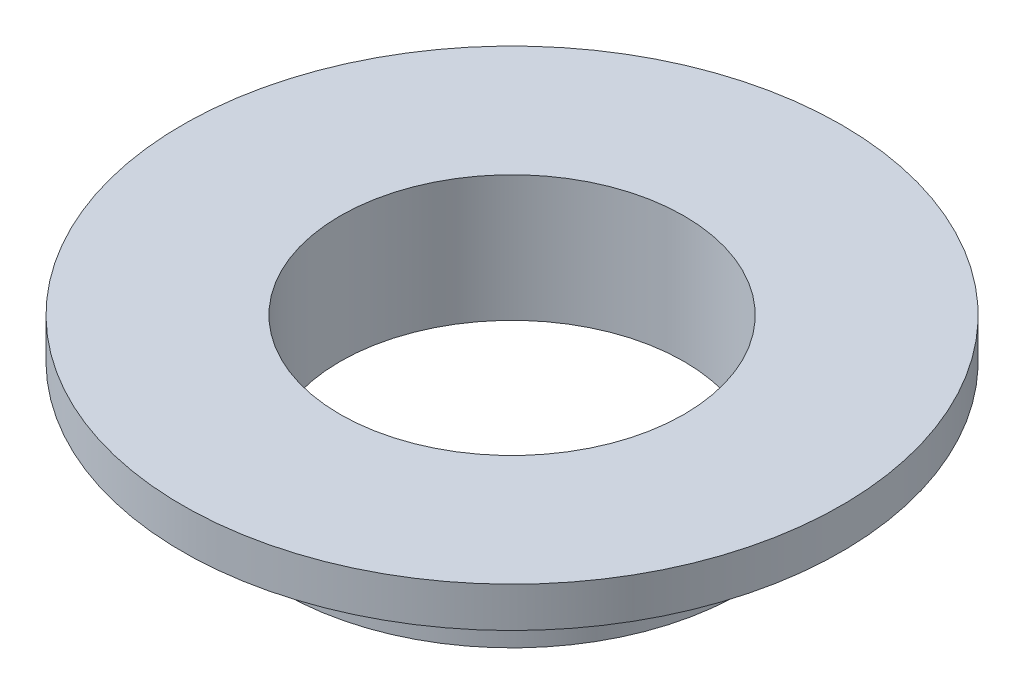
ISO-10303-21;
HEADER;
FILE_DESCRIPTION(('STEP AP214'),'2;1');
FILE_NAME('part.step','',(''),(''),'','','');
FILE_SCHEMA(('AUTOMOTIVE_DESIGN { 1 0 10303 214 1 1 1 1 }'));
ENDSEC;
DATA;
#1=APPLICATION_CONTEXT('core data for automotive mechanical design processes');
#2=APPLICATION_PROTOCOL_DEFINITION('international standard','automotive_design',2000,#1);
#3=PRODUCT_CONTEXT('',#1,'mechanical');
#4=PRODUCT('Part','Part','',(#3));
#5=PRODUCT_RELATED_PRODUCT_CATEGORY('part','',(#4));
#6=PRODUCT_DEFINITION_FORMATION('','',#4);
#7=PRODUCT_DEFINITION_CONTEXT('part definition',#1,'design');
#8=PRODUCT_DEFINITION('design','',#6,#7);
#9=PRODUCT_DEFINITION_SHAPE('','',#8);
#10=(LENGTH_UNIT() NAMED_UNIT(*) SI_UNIT(.MILLI.,.METRE.));
#11=(NAMED_UNIT(*) PLANE_ANGLE_UNIT() SI_UNIT($,.RADIAN.));
#12=(NAMED_UNIT(*) SI_UNIT($,.STERADIAN.) SOLID_ANGLE_UNIT());
#13=UNCERTAINTY_MEASURE_WITH_UNIT(LENGTH_MEASURE(1.E-05),#10,'distance_accuracy_value','');
#14=(GEOMETRIC_REPRESENTATION_CONTEXT(3) GLOBAL_UNCERTAINTY_ASSIGNED_CONTEXT((#13)) GLOBAL_UNIT_ASSIGNED_CONTEXT((#10,
#11,#12)) REPRESENTATION_CONTEXT('',''));
#15=CARTESIAN_POINT('',(0.,0.,0.));
#16=DIRECTION('',(0.,0.,1.));
#17=DIRECTION('',(1.,0.,0.));
#18=AXIS2_PLACEMENT_3D('',#15,#16,#17);
#19=CARTESIAN_POINT('',(0.,15.,0.));
#20=DIRECTION('',(0.,-1.,0.));
#21=DIRECTION('',(0.,0.,-1.));
#22=AXIS2_PLACEMENT_3D('',#19,#20,#21);
#23=CYLINDRICAL_SURFACE('',#22,40.);
#24=CARTESIAN_POINT('',(0.,15.,0.));
#25=DIRECTION('',(0.,-1.,0.));
#26=DIRECTION('',(0.,0.,-1.));
#27=AXIS2_PLACEMENT_3D('',#24,#25,#26);
#28=CIRCLE('',#27,40.);
#29=CARTESIAN_POINT('',(0.,15.,-40.));
#30=VERTEX_POINT('',#29);
#31=EDGE_CURVE('E33',#30,#30,#28,.T.);
#32=ORIENTED_EDGE('',*,*,#31,.T.);
#33=EDGE_LOOP('',(#32));
#34=FACE_BOUND('',#33,.T.);
#35=CARTESIAN_POINT('',(0.,0.,0.));
#36=DIRECTION('',(0.,-1.,0.));
#37=DIRECTION('',(0.,0.,-1.));
#38=AXIS2_PLACEMENT_3D('',#35,#36,#37);
#39=CIRCLE('',#38,40.);
#40=CARTESIAN_POINT('',(0.,0.,-40.));
#41=VERTEX_POINT('',#40);
#42=EDGE_CURVE('E17',#41,#41,#39,.F.);
#43=ORIENTED_EDGE('',*,*,#42,.T.);
#44=EDGE_LOOP('',(#43));
#45=FACE_BOUND('',#44,.T.);
#46=ADVANCED_FACE('F14',(#34,#45),#23,.T.);
#47=CARTESIAN_POINT('',(0.,0.,0.));
#48=DIRECTION('',(0.,1.,0.));
#49=DIRECTION('',(0.,0.,1.));
#50=AXIS2_PLACEMENT_3D('',#47,#48,#49);
#51=PLANE('',#50);
#52=ORIENTED_EDGE('',*,*,#42,.F.);
#53=EDGE_LOOP('',(#52));
#54=FACE_BOUND('',#53,.T.);
#55=CARTESIAN_POINT('',(0.,0.,0.));
#56=DIRECTION('',(0.,1.,0.));
#57=DIRECTION('',(0.,0.,1.));
#58=AXIS2_PLACEMENT_3D('',#55,#56,#57);
#59=CIRCLE('',#58,30.);
#60=CARTESIAN_POINT('',(0.,0.,30.));
#61=VERTEX_POINT('',#60);
#62=EDGE_CURVE('E31',#61,#61,#59,.T.);
#63=ORIENTED_EDGE('',*,*,#62,.T.);
#64=EDGE_LOOP('',(#63));
#65=FACE_BOUND('',#64,.T.);
#66=ADVANCED_FACE('F41',(#54,#65),#51,.F.);
#67=CARTESIAN_POINT('',(0.,15.,0.));
#68=DIRECTION('',(0.,1.,0.));
#69=DIRECTION('',(0.,0.,1.));
#70=AXIS2_PLACEMENT_3D('',#67,#68,#69);
#71=PLANE('',#70);
#72=ORIENTED_EDGE('',*,*,#31,.F.);
#73=EDGE_LOOP('',(#72));
#74=FACE_BOUND('',#73,.T.);
#75=CARTESIAN_POINT('',(0.,15.,0.));
#76=DIRECTION('',(0.,-1.,0.));
#77=DIRECTION('',(0.,0.,-1.));
#78=AXIS2_PLACEMENT_3D('',#75,#76,#77);
#79=CIRCLE('',#78,57.5);
#80=CARTESIAN_POINT('',(0.,15.,-57.5));
#81=VERTEX_POINT('',#80);
#82=EDGE_CURVE('E26',#81,#81,#79,.F.);
#83=ORIENTED_EDGE('',*,*,#82,.F.);
#84=EDGE_LOOP('',(#83));
#85=FACE_BOUND('',#84,.T.);
#86=ADVANCED_FACE('F44',(#74,#85),#71,.F.);
#87=CARTESIAN_POINT('',(0.,0.,0.));
#88=DIRECTION('',(0.,1.,0.));
#89=DIRECTION('',(0.,0.,1.));
#90=AXIS2_PLACEMENT_3D('',#87,#88,#89);
#91=CYLINDRICAL_SURFACE('',#90,30.);
#92=CARTESIAN_POINT('',(0.,22.,0.));
#93=DIRECTION('',(0.,1.,0.));
#94=DIRECTION('',(0.,0.,1.));
#95=AXIS2_PLACEMENT_3D('',#92,#93,#94);
#96=CIRCLE('',#95,30.);
#97=CARTESIAN_POINT('',(0.,22.,30.));
#98=VERTEX_POINT('',#97);
#99=EDGE_CURVE('E21',#98,#98,#96,.F.);
#100=ORIENTED_EDGE('',*,*,#99,.F.);
#101=EDGE_LOOP('',(#100));
#102=FACE_BOUND('',#101,.T.);
#103=ORIENTED_EDGE('',*,*,#62,.F.);
#104=EDGE_LOOP('',(#103));
#105=FACE_BOUND('',#104,.T.);
#106=ADVANCED_FACE('F47',(#102,#105),#91,.F.);
#107=CARTESIAN_POINT('',(0.,22.,0.));
#108=DIRECTION('',(0.,-1.,0.));
#109=DIRECTION('',(0.,0.,-1.));
#110=AXIS2_PLACEMENT_3D('',#107,#108,#109);
#111=CYLINDRICAL_SURFACE('',#110,57.5);
#112=ORIENTED_EDGE('',*,*,#82,.T.);
#113=EDGE_LOOP('',(#112));
#114=FACE_BOUND('',#113,.T.);
#115=CARTESIAN_POINT('',(0.,22.,0.));
#116=DIRECTION('',(0.,-1.,0.));
#117=DIRECTION('',(0.,0.,-1.));
#118=AXIS2_PLACEMENT_3D('',#115,#116,#117);
#119=CIRCLE('',#118,57.5);
#120=CARTESIAN_POINT('',(0.,22.,-57.5));
#121=VERTEX_POINT('',#120);
#122=EDGE_CURVE('E10',#121,#121,#119,.F.);
#123=ORIENTED_EDGE('',*,*,#122,.F.);
#124=EDGE_LOOP('',(#123));
#125=FACE_BOUND('',#124,.T.);
#126=ADVANCED_FACE('F49',(#114,#125),#111,.T.);
#127=CARTESIAN_POINT('',(0.,22.,0.));
#128=DIRECTION('',(0.,1.,0.));
#129=DIRECTION('',(0.,0.,1.));
#130=AXIS2_PLACEMENT_3D('',#127,#128,#129);
#131=PLANE('',#130);
#132=ORIENTED_EDGE('',*,*,#122,.T.);
#133=EDGE_LOOP('',(#132));
#134=FACE_BOUND('',#133,.T.);
#135=ORIENTED_EDGE('',*,*,#99,.T.);
#136=EDGE_LOOP('',(#135));
#137=FACE_BOUND('',#136,.T.);
#138=ADVANCED_FACE('F58',(#134,#137),#131,.T.);
#139=CLOSED_SHELL('',(#46,#66,#86,#106,#126,#138));
#140=MANIFOLD_SOLID_BREP('B1',#139);
#141=ADVANCED_BREP_SHAPE_REPRESENTATION('',(#18,#140),#14);
#142=SHAPE_DEFINITION_REPRESENTATION(#9,#141);
ENDSEC;
END-ISO-10303-21;
